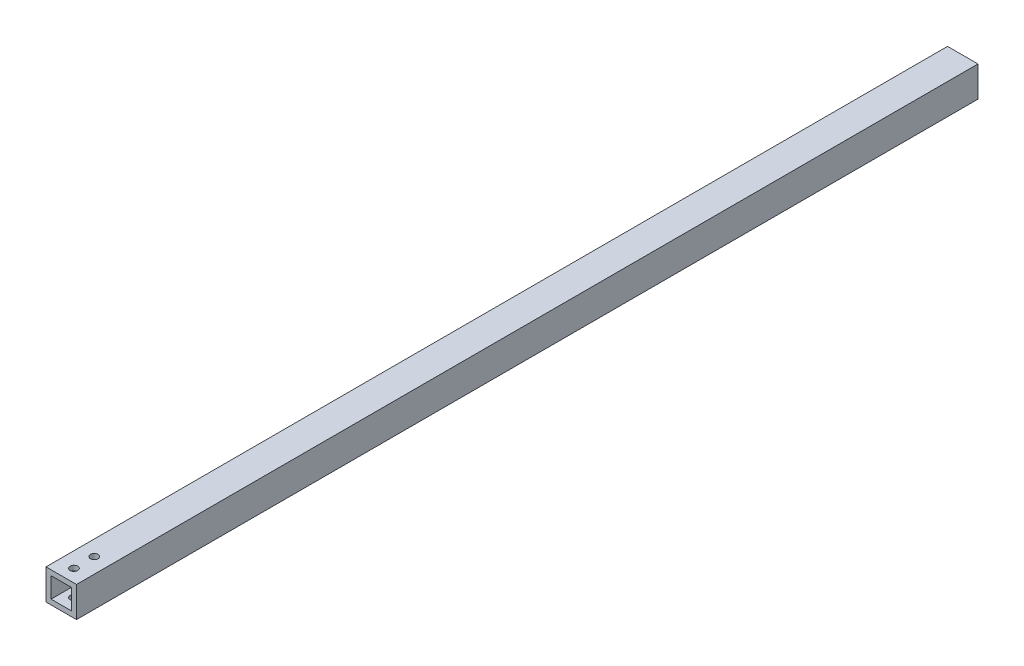
ISO-10303-21;
HEADER;
FILE_DESCRIPTION(('STEP AP214'),'2;1');
FILE_NAME('part.step','',(''),(''),'','','');
FILE_SCHEMA(('AUTOMOTIVE_DESIGN { 1 0 10303 214 1 1 1 1 }'));
ENDSEC;
DATA;
#1=APPLICATION_CONTEXT('core data for automotive mechanical design processes');
#2=APPLICATION_PROTOCOL_DEFINITION('international standard','automotive_design',2000,#1);
#3=PRODUCT_CONTEXT('',#1,'mechanical');
#4=PRODUCT('Part','Part','',(#3));
#5=PRODUCT_RELATED_PRODUCT_CATEGORY('part','',(#4));
#6=PRODUCT_DEFINITION_FORMATION('','',#4);
#7=PRODUCT_DEFINITION_CONTEXT('part definition',#1,'design');
#8=PRODUCT_DEFINITION('design','',#6,#7);
#9=PRODUCT_DEFINITION_SHAPE('','',#8);
#10=(LENGTH_UNIT() NAMED_UNIT(*) SI_UNIT(.MILLI.,.METRE.));
#11=(NAMED_UNIT(*) PLANE_ANGLE_UNIT() SI_UNIT($,.RADIAN.));
#12=(NAMED_UNIT(*) SI_UNIT($,.STERADIAN.) SOLID_ANGLE_UNIT());
#13=UNCERTAINTY_MEASURE_WITH_UNIT(LENGTH_MEASURE(1.E-05),#10,'distance_accuracy_value','');
#14=(GEOMETRIC_REPRESENTATION_CONTEXT(3) GLOBAL_UNCERTAINTY_ASSIGNED_CONTEXT((#13)) GLOBAL_UNIT_ASSIGNED_CONTEXT((#10,
#11,#12)) REPRESENTATION_CONTEXT('',''));
#15=CARTESIAN_POINT('',(0.,0.,0.));
#16=DIRECTION('',(0.,0.,1.));
#17=DIRECTION('',(1.,0.,0.));
#18=AXIS2_PLACEMENT_3D('',#15,#16,#17);
#19=CARTESIAN_POINT('',(0.,0.,355.));
#20=DIRECTION('',(0.,0.,1.));
#21=DIRECTION('',(1.,0.,0.));
#22=AXIS2_PLACEMENT_3D('',#19,#20,#21);
#23=PLANE('',#22);
#24=DIRECTION('',(0.,1.,0.));
#25=VECTOR('',#24,1.);
#26=CARTESIAN_POINT('',(6.,6.,355.));
#27=LINE('',#26,#25);
#28=CARTESIAN_POINT('',(6.,-6.,355.));
#29=VERTEX_POINT('',#28);
#30=CARTESIAN_POINT('',(6.,6.,355.));
#31=VERTEX_POINT('',#30);
#32=EDGE_CURVE('E139',#29,#31,#27,.T.);
#33=ORIENTED_EDGE('',*,*,#32,.T.);
#34=DIRECTION('',(-1.,0.,0.));
#35=VECTOR('',#34,1.);
#36=CARTESIAN_POINT('',(-6.,6.,355.));
#37=LINE('',#36,#35);
#38=CARTESIAN_POINT('',(-6.,6.,355.));
#39=VERTEX_POINT('',#38);
#40=EDGE_CURVE('E142',#31,#39,#37,.T.);
#41=ORIENTED_EDGE('',*,*,#40,.T.);
#42=DIRECTION('',(0.,-1.,0.));
#43=VECTOR('',#42,1.);
#44=CARTESIAN_POINT('',(-6.,6.,355.));
#45=LINE('',#44,#43);
#46=CARTESIAN_POINT('',(-6.,-6.,355.));
#47=VERTEX_POINT('',#46);
#48=EDGE_CURVE('E145',#39,#47,#45,.T.);
#49=ORIENTED_EDGE('',*,*,#48,.T.);
#50=DIRECTION('',(1.,0.,0.));
#51=VECTOR('',#50,1.);
#52=CARTESIAN_POINT('',(-6.,-6.,355.));
#53=LINE('',#52,#51);
#54=EDGE_CURVE('E147',#47,#29,#53,.T.);
#55=ORIENTED_EDGE('',*,*,#54,.T.);
#56=EDGE_LOOP('',(#33,#41,#49,#55));
#57=FACE_BOUND('',#56,.T.);
#58=DIRECTION('',(-1.,0.,0.));
#59=VECTOR('',#58,1.);
#60=CARTESIAN_POINT('',(-4.,4.,355.));
#61=LINE('',#60,#59);
#62=CARTESIAN_POINT('',(4.,4.,355.));
#63=VERTEX_POINT('',#62);
#64=CARTESIAN_POINT('',(-4.,4.,355.));
#65=VERTEX_POINT('',#64);
#66=EDGE_CURVE('E109',#63,#65,#61,.T.);
#67=ORIENTED_EDGE('',*,*,#66,.F.);
#68=DIRECTION('',(0.,1.,0.));
#69=VECTOR('',#68,1.);
#70=CARTESIAN_POINT('',(4.,4.,355.));
#71=LINE('',#70,#69);
#72=CARTESIAN_POINT('',(4.,-4.,355.));
#73=VERTEX_POINT('',#72);
#74=EDGE_CURVE('E101',#73,#63,#71,.T.);
#75=ORIENTED_EDGE('',*,*,#74,.F.);
#76=DIRECTION('',(1.,0.,0.));
#77=VECTOR('',#76,1.);
#78=CARTESIAN_POINT('',(-4.,-4.,355.));
#79=LINE('',#78,#77);
#80=CARTESIAN_POINT('',(-4.,-4.,355.));
#81=VERTEX_POINT('',#80);
#82=EDGE_CURVE('E123',#81,#73,#79,.T.);
#83=ORIENTED_EDGE('',*,*,#82,.F.);
#84=DIRECTION('',(0.,-1.,0.));
#85=VECTOR('',#84,1.);
#86=CARTESIAN_POINT('',(-4.,4.,355.));
#87=LINE('',#86,#85);
#88=EDGE_CURVE('E121',#65,#81,#87,.T.);
#89=ORIENTED_EDGE('',*,*,#88,.F.);
#90=EDGE_LOOP('',(#67,#75,#83,#89));
#91=FACE_BOUND('',#90,.T.);
#92=ADVANCED_FACE('F34',(#57,#91),#23,.T.);
#93=CARTESIAN_POINT('',(0.,0.,0.));
#94=DIRECTION('',(0.,0.,1.));
#95=DIRECTION('',(1.,0.,0.));
#96=AXIS2_PLACEMENT_3D('',#93,#94,#95);
#97=PLANE('',#96);
#98=DIRECTION('',(0.,1.,0.));
#99=VECTOR('',#98,1.);
#100=CARTESIAN_POINT('',(6.,6.,0.));
#101=LINE('',#100,#99);
#102=CARTESIAN_POINT('',(6.,-6.,0.));
#103=VERTEX_POINT('',#102);
#104=CARTESIAN_POINT('',(6.,6.,0.));
#105=VERTEX_POINT('',#104);
#106=EDGE_CURVE('E117',#103,#105,#101,.T.);
#107=ORIENTED_EDGE('',*,*,#106,.F.);
#108=DIRECTION('',(1.,0.,0.));
#109=VECTOR('',#108,1.);
#110=CARTESIAN_POINT('',(-6.,-6.,0.));
#111=LINE('',#110,#109);
#112=CARTESIAN_POINT('',(-6.,-6.,0.));
#113=VERTEX_POINT('',#112);
#114=EDGE_CURVE('E143',#113,#103,#111,.T.);
#115=ORIENTED_EDGE('',*,*,#114,.F.);
#116=DIRECTION('',(0.,-1.,0.));
#117=VECTOR('',#116,1.);
#118=CARTESIAN_POINT('',(-6.,6.,0.));
#119=LINE('',#118,#117);
#120=CARTESIAN_POINT('',(-6.,6.,0.));
#121=VERTEX_POINT('',#120);
#122=EDGE_CURVE('E154',#121,#113,#119,.T.);
#123=ORIENTED_EDGE('',*,*,#122,.F.);
#124=DIRECTION('',(-1.,0.,0.));
#125=VECTOR('',#124,1.);
#126=CARTESIAN_POINT('',(-6.,6.,0.));
#127=LINE('',#126,#125);
#128=EDGE_CURVE('E152',#105,#121,#127,.T.);
#129=ORIENTED_EDGE('',*,*,#128,.F.);
#130=EDGE_LOOP('',(#107,#115,#123,#129));
#131=FACE_BOUND('',#130,.T.);
#132=DIRECTION('',(0.,1.,0.));
#133=VECTOR('',#132,1.);
#134=CARTESIAN_POINT('',(4.,4.,0.));
#135=LINE('',#134,#133);
#136=CARTESIAN_POINT('',(4.,-4.,0.));
#137=VERTEX_POINT('',#136);
#138=CARTESIAN_POINT('',(4.,4.,0.));
#139=VERTEX_POINT('',#138);
#140=EDGE_CURVE('E59',#137,#139,#135,.T.);
#141=ORIENTED_EDGE('',*,*,#140,.T.);
#142=DIRECTION('',(-1.,0.,0.));
#143=VECTOR('',#142,1.);
#144=CARTESIAN_POINT('',(-4.,4.,0.));
#145=LINE('',#144,#143);
#146=CARTESIAN_POINT('',(-4.,4.,0.));
#147=VERTEX_POINT('',#146);
#148=EDGE_CURVE('E116',#139,#147,#145,.T.);
#149=ORIENTED_EDGE('',*,*,#148,.T.);
#150=DIRECTION('',(0.,-1.,0.));
#151=VECTOR('',#150,1.);
#152=CARTESIAN_POINT('',(-4.,4.,0.));
#153=LINE('',#152,#151);
#154=CARTESIAN_POINT('',(-4.,-4.,0.));
#155=VERTEX_POINT('',#154);
#156=EDGE_CURVE('E131',#147,#155,#153,.T.);
#157=ORIENTED_EDGE('',*,*,#156,.T.);
#158=DIRECTION('',(1.,0.,0.));
#159=VECTOR('',#158,1.);
#160=CARTESIAN_POINT('',(-4.,-4.,0.));
#161=LINE('',#160,#159);
#162=EDGE_CURVE('E110',#155,#137,#161,.T.);
#163=ORIENTED_EDGE('',*,*,#162,.T.);
#164=EDGE_LOOP('',(#141,#149,#157,#163));
#165=FACE_BOUND('',#164,.T.);
#166=ADVANCED_FACE('F201',(#131,#165),#97,.F.);
#167=CARTESIAN_POINT('',(6.,6.,355.));
#168=DIRECTION('',(-1.,0.,0.));
#169=DIRECTION('',(0.,0.,1.));
#170=AXIS2_PLACEMENT_3D('',#167,#168,#169);
#171=PLANE('',#170);
#172=ORIENTED_EDGE('',*,*,#106,.T.);
#173=DIRECTION('',(0.,0.,-1.));
#174=VECTOR('',#173,1.);
#175=CARTESIAN_POINT('',(6.,6.,355.));
#176=LINE('',#175,#174);
#177=EDGE_CURVE('E11',#31,#105,#176,.T.);
#178=ORIENTED_EDGE('',*,*,#177,.F.);
#179=ORIENTED_EDGE('',*,*,#32,.F.);
#180=DIRECTION('',(0.,0.,-1.));
#181=VECTOR('',#180,1.);
#182=CARTESIAN_POINT('',(6.,-6.,355.));
#183=LINE('',#182,#181);
#184=EDGE_CURVE('E149',#29,#103,#183,.T.);
#185=ORIENTED_EDGE('',*,*,#184,.T.);
#186=EDGE_LOOP('',(#172,#178,#179,#185));
#187=FACE_BOUND('',#186,.T.);
#188=ADVANCED_FACE('F36',(#187),#171,.F.);
#189=CARTESIAN_POINT('',(-6.,6.,355.));
#190=DIRECTION('',(0.,-1.,0.));
#191=DIRECTION('',(1.,0.,0.));
#192=AXIS2_PLACEMENT_3D('',#189,#190,#191);
#193=PLANE('',#192);
#194=CARTESIAN_POINT('',(0.,6.,350.));
#195=DIRECTION('',(0.,1.,0.));
#196=DIRECTION('',(-1.,0.,0.));
#197=AXIS2_PLACEMENT_3D('',#194,#195,#196);
#198=CIRCLE('',#197,1.5);
#199=CARTESIAN_POINT('',(-1.5,6.,350.));
#200=VERTEX_POINT('',#199);
#201=EDGE_CURVE('E172',#200,#200,#198,.T.);
#202=ORIENTED_EDGE('',*,*,#201,.F.);
#203=EDGE_LOOP('',(#202));
#204=FACE_BOUND('',#203,.T.);
#205=CARTESIAN_POINT('',(0.,6.,342.));
#206=DIRECTION('',(0.,1.,0.));
#207=DIRECTION('',(-1.,0.,0.));
#208=AXIS2_PLACEMENT_3D('',#205,#206,#207);
#209=CIRCLE('',#208,1.5);
#210=CARTESIAN_POINT('',(-1.5,6.,342.));
#211=VERTEX_POINT('',#210);
#212=EDGE_CURVE('E182',#211,#211,#209,.T.);
#213=ORIENTED_EDGE('',*,*,#212,.F.);
#214=EDGE_LOOP('',(#213));
#215=FACE_BOUND('',#214,.T.);
#216=ORIENTED_EDGE('',*,*,#128,.T.);
#217=DIRECTION('',(0.,0.,-1.));
#218=VECTOR('',#217,1.);
#219=CARTESIAN_POINT('',(-6.,6.,355.));
#220=LINE('',#219,#218);
#221=EDGE_CURVE('E43',#39,#121,#220,.T.);
#222=ORIENTED_EDGE('',*,*,#221,.F.);
#223=ORIENTED_EDGE('',*,*,#40,.F.);
#224=ORIENTED_EDGE('',*,*,#177,.T.);
#225=EDGE_LOOP('',(#216,#222,#223,#224));
#226=FACE_BOUND('',#225,.T.);
#227=ADVANCED_FACE('F225',(#204,#215,#226),#193,.F.);
#228=CARTESIAN_POINT('',(-6.,6.,355.));
#229=DIRECTION('',(1.,0.,0.));
#230=DIRECTION('',(0.,1.,0.));
#231=AXIS2_PLACEMENT_3D('',#228,#229,#230);
#232=PLANE('',#231);
#233=ORIENTED_EDGE('',*,*,#122,.T.);
#234=DIRECTION('',(0.,0.,-1.));
#235=VECTOR('',#234,1.);
#236=CARTESIAN_POINT('',(-6.,-6.,355.));
#237=LINE('',#236,#235);
#238=EDGE_CURVE('E159',#47,#113,#237,.T.);
#239=ORIENTED_EDGE('',*,*,#238,.F.);
#240=ORIENTED_EDGE('',*,*,#48,.F.);
#241=ORIENTED_EDGE('',*,*,#221,.T.);
#242=EDGE_LOOP('',(#233,#239,#240,#241));
#243=FACE_BOUND('',#242,.T.);
#244=ADVANCED_FACE('F223',(#243),#232,.F.);
#245=CARTESIAN_POINT('',(-6.,-6.,355.));
#246=DIRECTION('',(0.,1.,0.));
#247=DIRECTION('',(-1.,0.,0.));
#248=AXIS2_PLACEMENT_3D('',#245,#246,#247);
#249=PLANE('',#248);
#250=CARTESIAN_POINT('',(0.,-6.,350.));
#251=DIRECTION('',(0.,1.,0.));
#252=DIRECTION('',(-1.,0.,0.));
#253=AXIS2_PLACEMENT_3D('',#250,#251,#252);
#254=CIRCLE('',#253,1.5);
#255=CARTESIAN_POINT('',(-1.5,-6.,350.));
#256=VERTEX_POINT('',#255);
#257=EDGE_CURVE('E166',#256,#256,#254,.T.);
#258=ORIENTED_EDGE('',*,*,#257,.T.);
#259=EDGE_LOOP('',(#258));
#260=FACE_BOUND('',#259,.T.);
#261=CARTESIAN_POINT('',(0.,-6.,342.));
#262=DIRECTION('',(0.,1.,0.));
#263=DIRECTION('',(-1.,0.,0.));
#264=AXIS2_PLACEMENT_3D('',#261,#262,#263);
#265=CIRCLE('',#264,1.5);
#266=CARTESIAN_POINT('',(-1.5,-6.,342.));
#267=VERTEX_POINT('',#266);
#268=EDGE_CURVE('E177',#267,#267,#265,.T.);
#269=ORIENTED_EDGE('',*,*,#268,.T.);
#270=EDGE_LOOP('',(#269));
#271=FACE_BOUND('',#270,.T.);
#272=ORIENTED_EDGE('',*,*,#114,.T.);
#273=ORIENTED_EDGE('',*,*,#184,.F.);
#274=ORIENTED_EDGE('',*,*,#54,.F.);
#275=ORIENTED_EDGE('',*,*,#238,.T.);
#276=EDGE_LOOP('',(#272,#273,#274,#275));
#277=FACE_BOUND('',#276,.T.);
#278=ADVANCED_FACE('F220',(#260,#271,#277),#249,.F.);
#279=CARTESIAN_POINT('',(4.,4.,355.));
#280=DIRECTION('',(-1.,0.,0.));
#281=DIRECTION('',(0.,0.,1.));
#282=AXIS2_PLACEMENT_3D('',#279,#280,#281);
#283=PLANE('',#282);
#284=ORIENTED_EDGE('',*,*,#140,.F.);
#285=DIRECTION('',(0.,0.,-1.));
#286=VECTOR('',#285,1.);
#287=CARTESIAN_POINT('',(4.,-4.,355.));
#288=LINE('',#287,#286);
#289=EDGE_CURVE('E105',#73,#137,#288,.T.);
#290=ORIENTED_EDGE('',*,*,#289,.F.);
#291=ORIENTED_EDGE('',*,*,#74,.T.);
#292=DIRECTION('',(0.,0.,-1.));
#293=VECTOR('',#292,1.);
#294=CARTESIAN_POINT('',(4.,4.,355.));
#295=LINE('',#294,#293);
#296=EDGE_CURVE('E104',#63,#139,#295,.T.);
#297=ORIENTED_EDGE('',*,*,#296,.T.);
#298=EDGE_LOOP('',(#284,#290,#291,#297));
#299=FACE_BOUND('',#298,.T.);
#300=ADVANCED_FACE('F103',(#299),#283,.T.);
#301=CARTESIAN_POINT('',(-4.,4.,355.));
#302=DIRECTION('',(0.,-1.,0.));
#303=DIRECTION('',(0.,0.,-1.));
#304=AXIS2_PLACEMENT_3D('',#301,#302,#303);
#305=PLANE('',#304);
#306=CARTESIAN_POINT('',(0.,4.,350.));
#307=DIRECTION('',(0.,-1.,0.));
#308=DIRECTION('',(0.,0.,-1.));
#309=AXIS2_PLACEMENT_3D('',#306,#307,#308);
#310=CIRCLE('',#309,1.5);
#311=CARTESIAN_POINT('',(0.,4.,348.5));
#312=VERTEX_POINT('',#311);
#313=EDGE_CURVE('E129',#312,#312,#310,.T.);
#314=ORIENTED_EDGE('',*,*,#313,.F.);
#315=EDGE_LOOP('',(#314));
#316=FACE_BOUND('',#315,.T.);
#317=CARTESIAN_POINT('',(0.,4.,342.));
#318=DIRECTION('',(0.,-1.,0.));
#319=DIRECTION('',(0.,0.,-1.));
#320=AXIS2_PLACEMENT_3D('',#317,#318,#319);
#321=CIRCLE('',#320,1.5);
#322=CARTESIAN_POINT('',(0.,4.,340.5));
#323=VERTEX_POINT('',#322);
#324=EDGE_CURVE('E165',#323,#323,#321,.T.);
#325=ORIENTED_EDGE('',*,*,#324,.F.);
#326=EDGE_LOOP('',(#325));
#327=FACE_BOUND('',#326,.T.);
#328=ORIENTED_EDGE('',*,*,#148,.F.);
#329=ORIENTED_EDGE('',*,*,#296,.F.);
#330=ORIENTED_EDGE('',*,*,#66,.T.);
#331=DIRECTION('',(0.,0.,-1.));
#332=VECTOR('',#331,1.);
#333=CARTESIAN_POINT('',(-4.,4.,355.));
#334=LINE('',#333,#332);
#335=EDGE_CURVE('E118',#65,#147,#334,.T.);
#336=ORIENTED_EDGE('',*,*,#335,.T.);
#337=EDGE_LOOP('',(#328,#329,#330,#336));
#338=FACE_BOUND('',#337,.T.);
#339=ADVANCED_FACE('F113',(#316,#327,#338),#305,.T.);
#340=CARTESIAN_POINT('',(-4.,4.,355.));
#341=DIRECTION('',(1.,0.,0.));
#342=DIRECTION('',(0.,1.,0.));
#343=AXIS2_PLACEMENT_3D('',#340,#341,#342);
#344=PLANE('',#343);
#345=ORIENTED_EDGE('',*,*,#156,.F.);
#346=ORIENTED_EDGE('',*,*,#335,.F.);
#347=ORIENTED_EDGE('',*,*,#88,.T.);
#348=DIRECTION('',(0.,0.,-1.));
#349=VECTOR('',#348,1.);
#350=CARTESIAN_POINT('',(-4.,-4.,355.));
#351=LINE('',#350,#349);
#352=EDGE_CURVE('E51',#81,#155,#351,.T.);
#353=ORIENTED_EDGE('',*,*,#352,.T.);
#354=EDGE_LOOP('',(#345,#346,#347,#353));
#355=FACE_BOUND('',#354,.T.);
#356=ADVANCED_FACE('F197',(#355),#344,.T.);
#357=CARTESIAN_POINT('',(-4.,-4.,355.));
#358=DIRECTION('',(0.,1.,0.));
#359=DIRECTION('',(-1.,0.,0.));
#360=AXIS2_PLACEMENT_3D('',#357,#358,#359);
#361=PLANE('',#360);
#362=CARTESIAN_POINT('',(0.,-4.,350.));
#363=DIRECTION('',(0.,1.,0.));
#364=DIRECTION('',(-1.,0.,0.));
#365=AXIS2_PLACEMENT_3D('',#362,#363,#364);
#366=CIRCLE('',#365,1.5);
#367=CARTESIAN_POINT('',(-1.5,-4.,350.));
#368=VERTEX_POINT('',#367);
#369=EDGE_CURVE('E38',#368,#368,#366,.T.);
#370=ORIENTED_EDGE('',*,*,#369,.F.);
#371=EDGE_LOOP('',(#370));
#372=FACE_BOUND('',#371,.T.);
#373=CARTESIAN_POINT('',(0.,-4.,342.));
#374=DIRECTION('',(0.,1.,0.));
#375=DIRECTION('',(-1.,0.,0.));
#376=AXIS2_PLACEMENT_3D('',#373,#374,#375);
#377=CIRCLE('',#376,1.5);
#378=CARTESIAN_POINT('',(-1.5,-4.,342.));
#379=VERTEX_POINT('',#378);
#380=EDGE_CURVE('E163',#379,#379,#377,.T.);
#381=ORIENTED_EDGE('',*,*,#380,.F.);
#382=EDGE_LOOP('',(#381));
#383=FACE_BOUND('',#382,.T.);
#384=ORIENTED_EDGE('',*,*,#162,.F.);
#385=ORIENTED_EDGE('',*,*,#352,.F.);
#386=ORIENTED_EDGE('',*,*,#82,.T.);
#387=ORIENTED_EDGE('',*,*,#289,.T.);
#388=EDGE_LOOP('',(#384,#385,#386,#387));
#389=FACE_BOUND('',#388,.T.);
#390=ADVANCED_FACE('F193',(#372,#383,#389),#361,.T.);
#391=CARTESIAN_POINT('',(0.,-6.,342.));
#392=DIRECTION('',(0.,1.,0.));
#393=DIRECTION('',(-1.,0.,0.));
#394=AXIS2_PLACEMENT_3D('',#391,#392,#393);
#395=CYLINDRICAL_SURFACE('',#394,1.5);
#396=ORIENTED_EDGE('',*,*,#380,.T.);
#397=EDGE_LOOP('',(#396));
#398=FACE_BOUND('',#397,.T.);
#399=ORIENTED_EDGE('',*,*,#268,.F.);
#400=EDGE_LOOP('',(#399));
#401=FACE_BOUND('',#400,.T.);
#402=ADVANCED_FACE('F196',(#398,#401),#395,.F.);
#403=CARTESIAN_POINT('',(0.,-6.,350.));
#404=DIRECTION('',(0.,1.,0.));
#405=DIRECTION('',(-1.,0.,0.));
#406=AXIS2_PLACEMENT_3D('',#403,#404,#405);
#407=CYLINDRICAL_SURFACE('',#406,1.5);
#408=ORIENTED_EDGE('',*,*,#369,.T.);
#409=EDGE_LOOP('',(#408));
#410=FACE_BOUND('',#409,.T.);
#411=ORIENTED_EDGE('',*,*,#257,.F.);
#412=EDGE_LOOP('',(#411));
#413=FACE_BOUND('',#412,.T.);
#414=ADVANCED_FACE('F190',(#410,#413),#407,.F.);
#415=ORIENTED_EDGE('',*,*,#324,.T.);
#416=EDGE_LOOP('',(#415));
#417=FACE_BOUND('',#416,.T.);
#418=ORIENTED_EDGE('',*,*,#212,.T.);
#419=EDGE_LOOP('',(#418));
#420=FACE_BOUND('',#419,.T.);
#421=ADVANCED_FACE('F249',(#417,#420),#395,.F.);
#422=ORIENTED_EDGE('',*,*,#313,.T.);
#423=EDGE_LOOP('',(#422));
#424=FACE_BOUND('',#423,.T.);
#425=ORIENTED_EDGE('',*,*,#201,.T.);
#426=EDGE_LOOP('',(#425));
#427=FACE_BOUND('',#426,.T.);
#428=ADVANCED_FACE('F251',(#424,#427),#407,.F.);
#429=CLOSED_SHELL('',(#92,#166,#188,#227,#244,#278,#300,#339,#356,#390,#402,#414,#421,#428));
#430=MANIFOLD_SOLID_BREP('B2',#429);
#431=ADVANCED_BREP_SHAPE_REPRESENTATION('',(#18,#430),#14);
#432=SHAPE_DEFINITION_REPRESENTATION(#9,#431);
ENDSEC;
END-ISO-10303-21;
